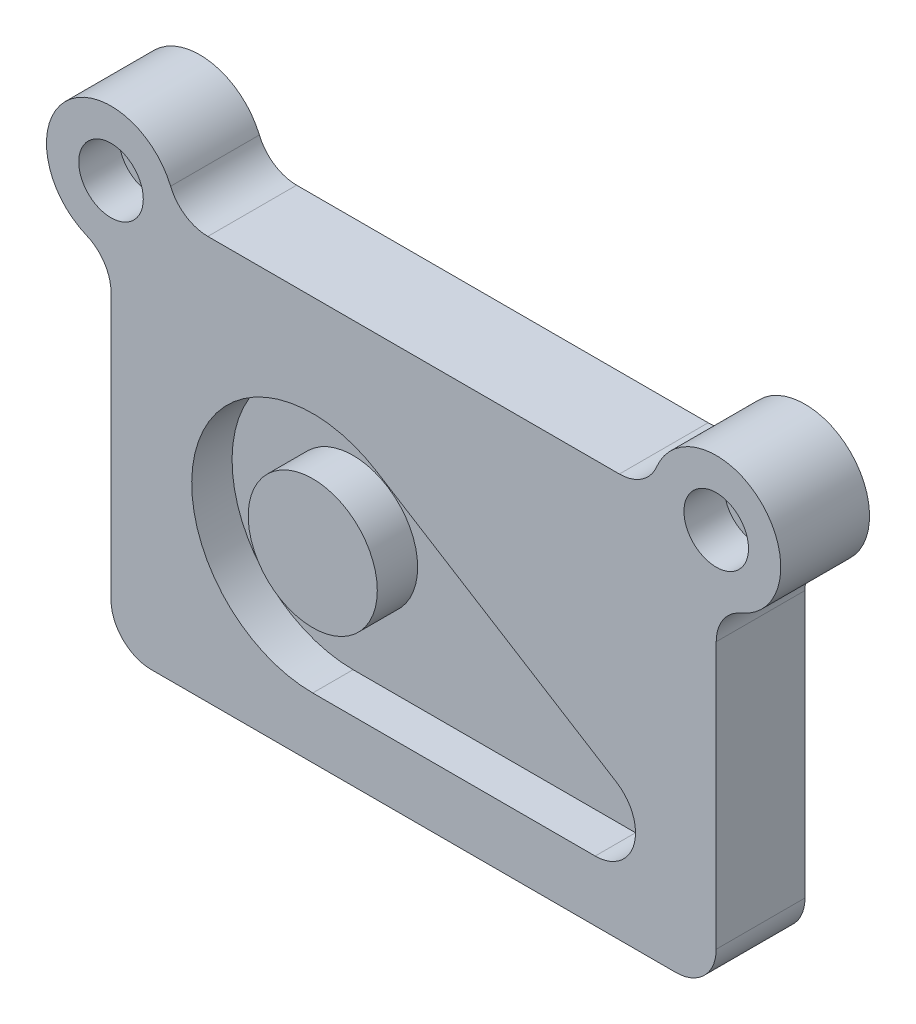
ISO-10303-21;
HEADER;
FILE_DESCRIPTION(('STEP AP214'),'2;1');
FILE_NAME('part.step','',(''),(''),'','','');
FILE_SCHEMA(('AUTOMOTIVE_DESIGN { 1 0 10303 214 1 1 1 1 }'));
ENDSEC;
DATA;
#1=APPLICATION_CONTEXT('core data for automotive mechanical design processes');
#2=APPLICATION_PROTOCOL_DEFINITION('international standard','automotive_design',2000,#1);
#3=PRODUCT_CONTEXT('',#1,'mechanical');
#4=PRODUCT('Part','Part','',(#3));
#5=PRODUCT_RELATED_PRODUCT_CATEGORY('part','',(#4));
#6=PRODUCT_DEFINITION_FORMATION('','',#4);
#7=PRODUCT_DEFINITION_CONTEXT('part definition',#1,'design');
#8=PRODUCT_DEFINITION('design','',#6,#7);
#9=PRODUCT_DEFINITION_SHAPE('','',#8);
#10=(LENGTH_UNIT() NAMED_UNIT(*) SI_UNIT(.MILLI.,.METRE.));
#11=(NAMED_UNIT(*) PLANE_ANGLE_UNIT() SI_UNIT($,.RADIAN.));
#12=(NAMED_UNIT(*) SI_UNIT($,.STERADIAN.) SOLID_ANGLE_UNIT());
#13=UNCERTAINTY_MEASURE_WITH_UNIT(LENGTH_MEASURE(1.E-05),#10,'distance_accuracy_value','');
#14=(GEOMETRIC_REPRESENTATION_CONTEXT(3) GLOBAL_UNCERTAINTY_ASSIGNED_CONTEXT((#13)) GLOBAL_UNIT_ASSIGNED_CONTEXT((#10,
#11,#12)) REPRESENTATION_CONTEXT('',''));
#15=CARTESIAN_POINT('',(0.,0.,0.));
#16=DIRECTION('',(0.,0.,1.));
#17=DIRECTION('',(1.,0.,0.));
#18=AXIS2_PLACEMENT_3D('',#15,#16,#17);
#19=CARTESIAN_POINT('',(150.,100.,-22.));
#20=DIRECTION('',(0.,0.,1.));
#21=DIRECTION('',(1.,0.,0.));
#22=AXIS2_PLACEMENT_3D('',#19,#20,#21);
#23=CYLINDRICAL_SURFACE('',#22,2.99999999999999);
#24=CARTESIAN_POINT('',(150.,100.,-22.));
#25=DIRECTION('',(0.,0.,1.));
#26=DIRECTION('',(1.,0.,0.));
#27=AXIS2_PLACEMENT_3D('',#24,#25,#26);
#28=CIRCLE('',#27,2.99999999999999);
#29=CARTESIAN_POINT('',(153.,100.,-22.));
#30=VERTEX_POINT('',#29);
#31=EDGE_CURVE('E366',#30,#30,#28,.T.);
#32=ORIENTED_EDGE('',*,*,#31,.F.);
#33=EDGE_LOOP('',(#32));
#34=FACE_BOUND('',#33,.T.);
#35=CARTESIAN_POINT('',(150.,100.,-10.));
#36=DIRECTION('',(0.,0.,1.));
#37=DIRECTION('',(1.,0.,0.));
#38=AXIS2_PLACEMENT_3D('',#35,#36,#37);
#39=CIRCLE('',#38,2.99999999999999);
#40=CARTESIAN_POINT('',(153.,100.,-10.));
#41=VERTEX_POINT('',#40);
#42=EDGE_CURVE('E129',#41,#41,#39,.F.);
#43=ORIENTED_EDGE('',*,*,#42,.F.);
#44=EDGE_LOOP('',(#43));
#45=FACE_BOUND('',#44,.T.);
#46=ADVANCED_FACE('F125',(#34,#45),#23,.F.);
#47=CARTESIAN_POINT('',(0.,100.,-22.));
#48=DIRECTION('',(0.,0.,1.));
#49=DIRECTION('',(1.,0.,0.));
#50=AXIS2_PLACEMENT_3D('',#47,#48,#49);
#51=CYLINDRICAL_SURFACE('',#50,3.);
#52=CARTESIAN_POINT('',(0.,100.,-22.));
#53=DIRECTION('',(0.,0.,1.));
#54=DIRECTION('',(1.,0.,0.));
#55=AXIS2_PLACEMENT_3D('',#52,#53,#54);
#56=CIRCLE('',#55,3.);
#57=CARTESIAN_POINT('',(3.,100.,-22.));
#58=VERTEX_POINT('',#57);
#59=EDGE_CURVE('E266',#58,#58,#56,.T.);
#60=ORIENTED_EDGE('',*,*,#59,.F.);
#61=EDGE_LOOP('',(#60));
#62=FACE_BOUND('',#61,.T.);
#63=CARTESIAN_POINT('',(0.,100.,-10.));
#64=DIRECTION('',(0.,0.,1.));
#65=DIRECTION('',(1.,0.,0.));
#66=AXIS2_PLACEMENT_3D('',#63,#64,#65);
#67=CIRCLE('',#66,3.);
#68=CARTESIAN_POINT('',(3.,100.,-10.));
#69=VERTEX_POINT('',#68);
#70=EDGE_CURVE('E312',#69,#69,#67,.F.);
#71=ORIENTED_EDGE('',*,*,#70,.F.);
#72=EDGE_LOOP('',(#71));
#73=FACE_BOUND('',#72,.T.);
#74=ADVANCED_FACE('F423',(#62,#73),#51,.F.);
#75=CARTESIAN_POINT('',(140.,10.,0.));
#76=DIRECTION('',(0.,0.,1.));
#77=DIRECTION('',(1.,0.,0.));
#78=AXIS2_PLACEMENT_3D('',#75,#76,#77);
#79=PLANE('',#78);
#80=CARTESIAN_POINT('',(150.,100.,0.));
#81=DIRECTION('',(0.,0.,1.));
#82=DIRECTION('',(1.,0.,0.));
#83=AXIS2_PLACEMENT_3D('',#80,#81,#82);
#84=CIRCLE('',#83,8.00000000000001);
#85=CARTESIAN_POINT('',(158.,100.,0.));
#86=VERTEX_POINT('',#85);
#87=EDGE_CURVE('E664',#86,#86,#84,.T.);
#88=ORIENTED_EDGE('',*,*,#87,.F.);
#89=EDGE_LOOP('',(#88));
#90=FACE_BOUND('',#89,.T.);
#91=CARTESIAN_POINT('',(0.,100.,0.));
#92=DIRECTION('',(0.,0.,1.));
#93=DIRECTION('',(1.,0.,0.));
#94=AXIS2_PLACEMENT_3D('',#91,#92,#93);
#95=CIRCLE('',#94,8.);
#96=CARTESIAN_POINT('',(8.,100.,0.));
#97=VERTEX_POINT('',#96);
#98=EDGE_CURVE('E322',#97,#97,#95,.T.);
#99=ORIENTED_EDGE('',*,*,#98,.F.);
#100=EDGE_LOOP('',(#99));
#101=FACE_BOUND('',#100,.T.);
#102=CARTESIAN_POINT('',(140.,10.,0.));
#103=DIRECTION('',(0.,0.,1.));
#104=DIRECTION('',(1.,0.,0.));
#105=AXIS2_PLACEMENT_3D('',#102,#103,#104);
#106=CIRCLE('',#105,10.);
#107=CARTESIAN_POINT('',(140.,0.,0.));
#108=VERTEX_POINT('',#107);
#109=CARTESIAN_POINT('',(150.,10.0000000000001,0.));
#110=VERTEX_POINT('',#109);
#111=EDGE_CURVE('E262',#108,#110,#106,.T.);
#112=ORIENTED_EDGE('',*,*,#111,.T.);
#113=DIRECTION('',(0.,-1.,0.));
#114=VECTOR('',#113,1.);
#115=CARTESIAN_POINT('',(150.,76.,0.));
#116=LINE('',#115,#114);
#117=CARTESIAN_POINT('',(150.,76.,0.));
#118=VERTEX_POINT('',#117);
#119=EDGE_CURVE('E265',#118,#110,#116,.T.);
#120=ORIENTED_EDGE('',*,*,#119,.F.);
#121=CARTESIAN_POINT('',(160.,76.,0.));
#122=DIRECTION('',(0.,0.,-1.));
#123=DIRECTION('',(-1.,0.,0.));
#124=AXIS2_PLACEMENT_3D('',#121,#122,#123);
#125=CIRCLE('',#124,10.);
#126=CARTESIAN_POINT('',(156.153846153846,85.2307692307693,0.));
#127=VERTEX_POINT('',#126);
#128=EDGE_CURVE('E269',#118,#127,#125,.T.);
#129=ORIENTED_EDGE('',*,*,#128,.T.);
#130=CARTESIAN_POINT('',(150.,100.,0.));
#131=DIRECTION('',(0.,0.,1.));
#132=DIRECTION('',(1.,0.,0.));
#133=AXIS2_PLACEMENT_3D('',#130,#131,#132);
#134=CIRCLE('',#133,16.);
#135=CARTESIAN_POINT('',(135.230769230769,106.153846153846,0.));
#136=VERTEX_POINT('',#135);
#137=EDGE_CURVE('E272',#127,#136,#134,.T.);
#138=ORIENTED_EDGE('',*,*,#137,.T.);
#139=CARTESIAN_POINT('',(126.,110.,0.));
#140=DIRECTION('',(0.,0.,-1.));
#141=DIRECTION('',(-1.,0.,0.));
#142=AXIS2_PLACEMENT_3D('',#139,#140,#141);
#143=CIRCLE('',#142,10.);
#144=CARTESIAN_POINT('',(126.,100.,0.));
#145=VERTEX_POINT('',#144);
#146=EDGE_CURVE('E275',#136,#145,#143,.T.);
#147=ORIENTED_EDGE('',*,*,#146,.T.);
#148=DIRECTION('',(-1.,0.,0.));
#149=VECTOR('',#148,1.);
#150=CARTESIAN_POINT('',(126.,100.,0.));
#151=LINE('',#150,#149);
#152=CARTESIAN_POINT('',(24.,100.,0.));
#153=VERTEX_POINT('',#152);
#154=EDGE_CURVE('E278',#145,#153,#151,.T.);
#155=ORIENTED_EDGE('',*,*,#154,.T.);
#156=CARTESIAN_POINT('',(24.,110.,0.));
#157=DIRECTION('',(0.,0.,-1.));
#158=DIRECTION('',(-1.,0.,0.));
#159=AXIS2_PLACEMENT_3D('',#156,#157,#158);
#160=CIRCLE('',#159,10.);
#161=CARTESIAN_POINT('',(14.7692307692308,106.153846153846,0.));
#162=VERTEX_POINT('',#161);
#163=EDGE_CURVE('E281',#153,#162,#160,.T.);
#164=ORIENTED_EDGE('',*,*,#163,.T.);
#165=CARTESIAN_POINT('',(0.,100.,0.));
#166=DIRECTION('',(0.,0.,1.));
#167=DIRECTION('',(1.,0.,0.));
#168=AXIS2_PLACEMENT_3D('',#165,#166,#167);
#169=CIRCLE('',#168,16.);
#170=CARTESIAN_POINT('',(-6.15384615384616,85.2307692307692,0.));
#171=VERTEX_POINT('',#170);
#172=EDGE_CURVE('E284',#162,#171,#169,.T.);
#173=ORIENTED_EDGE('',*,*,#172,.T.);
#174=CARTESIAN_POINT('',(-10.,76.,0.));
#175=DIRECTION('',(0.,0.,-1.));
#176=DIRECTION('',(-1.,0.,0.));
#177=AXIS2_PLACEMENT_3D('',#174,#175,#176);
#178=CIRCLE('',#177,10.);
#179=CARTESIAN_POINT('',(0.,76.,0.));
#180=VERTEX_POINT('',#179);
#181=EDGE_CURVE('E287',#171,#180,#178,.T.);
#182=ORIENTED_EDGE('',*,*,#181,.T.);
#183=DIRECTION('',(0.,-1.,0.));
#184=VECTOR('',#183,1.);
#185=CARTESIAN_POINT('',(0.,76.,0.));
#186=LINE('',#185,#184);
#187=CARTESIAN_POINT('',(0.,10.0000000000001,0.));
#188=VERTEX_POINT('',#187);
#189=EDGE_CURVE('E290',#180,#188,#186,.T.);
#190=ORIENTED_EDGE('',*,*,#189,.T.);
#191=CARTESIAN_POINT('',(10.,10.,0.));
#192=DIRECTION('',(0.,0.,1.));
#193=DIRECTION('',(1.,0.,0.));
#194=AXIS2_PLACEMENT_3D('',#191,#192,#193);
#195=CIRCLE('',#194,10.);
#196=CARTESIAN_POINT('',(10.0000000000001,0.,0.));
#197=VERTEX_POINT('',#196);
#198=EDGE_CURVE('E238',#188,#197,#195,.T.);
#199=ORIENTED_EDGE('',*,*,#198,.T.);
#200=DIRECTION('',(-1.,0.,0.));
#201=VECTOR('',#200,1.);
#202=CARTESIAN_POINT('',(140.,0.,0.));
#203=LINE('',#202,#201);
#204=EDGE_CURVE('E293',#108,#197,#203,.T.);
#205=ORIENTED_EDGE('',*,*,#204,.F.);
#206=EDGE_LOOP('',(#112,#120,#129,#138,#147,#155,#164,#173,#182,#190,#199,#205));
#207=FACE_BOUND('',#206,.T.);
#208=CARTESIAN_POINT('',(120.,25.,0.));
#209=DIRECTION('',(0.,0.,1.));
#210=DIRECTION('',(1.,0.,0.));
#211=AXIS2_PLACEMENT_3D('',#208,#209,#210);
#212=CIRCLE('',#211,10.);
#213=CARTESIAN_POINT('',(120.,15.,0.));
#214=VERTEX_POINT('',#213);
#215=CARTESIAN_POINT('',(125.283018867925,33.4905660377358,0.));
#216=VERTEX_POINT('',#215);
#217=EDGE_CURVE('E338',#214,#216,#212,.T.);
#218=ORIENTED_EDGE('',*,*,#217,.F.);
#219=DIRECTION('',(-1.,0.,0.));
#220=VECTOR('',#219,1.);
#221=CARTESIAN_POINT('',(140.,15.,0.));
#222=LINE('',#221,#220);
#223=CARTESIAN_POINT('',(50.,15.,0.));
#224=VERTEX_POINT('',#223);
#225=EDGE_CURVE('E142',#214,#224,#222,.T.);
#226=ORIENTED_EDGE('',*,*,#225,.T.);
#227=CARTESIAN_POINT('',(50.,45.,0.));
#228=DIRECTION('',(0.,0.,1.));
#229=DIRECTION('',(1.,0.,0.));
#230=AXIS2_PLACEMENT_3D('',#227,#228,#229);
#231=CIRCLE('',#230,30.);
#232=CARTESIAN_POINT('',(65.8490566037736,70.4716981132076,0.));
#233=VERTEX_POINT('',#232);
#234=EDGE_CURVE('E349',#233,#224,#231,.T.);
#235=ORIENTED_EDGE('',*,*,#234,.F.);
#236=DIRECTION('',(-0.849056603773585,0.528301886792453,0.));
#237=VECTOR('',#236,1.);
#238=CARTESIAN_POINT('',(146.429334282663,20.3328586685653,0.));
#239=LINE('',#238,#237);
#240=EDGE_CURVE('E352',#216,#233,#239,.T.);
#241=ORIENTED_EDGE('',*,*,#240,.F.);
#242=EDGE_LOOP('',(#218,#226,#235,#241));
#243=FACE_BOUND('',#242,.T.);
#244=ADVANCED_FACE('F417',(#90,#101,#207,#243),#79,.T.);
#245=CARTESIAN_POINT('',(140.,10.,-22.));
#246=DIRECTION('',(0.,0.,1.));
#247=DIRECTION('',(1.,0.,0.));
#248=AXIS2_PLACEMENT_3D('',#245,#246,#247);
#249=CYLINDRICAL_SURFACE('',#248,10.);
#250=ORIENTED_EDGE('',*,*,#111,.F.);
#251=DIRECTION('',(0.,0.,1.));
#252=VECTOR('',#251,1.);
#253=CARTESIAN_POINT('',(140.,0.,-22.));
#254=LINE('',#253,#252);
#255=CARTESIAN_POINT('',(140.,0.,-22.));
#256=VERTEX_POINT('',#255);
#257=EDGE_CURVE('E12',#256,#108,#254,.T.);
#258=ORIENTED_EDGE('',*,*,#257,.F.);
#259=CARTESIAN_POINT('',(140.,10.,-22.));
#260=DIRECTION('',(0.,0.,1.));
#261=DIRECTION('',(1.,0.,0.));
#262=AXIS2_PLACEMENT_3D('',#259,#260,#261);
#263=CIRCLE('',#262,10.);
#264=CARTESIAN_POINT('',(150.,10.0000000000001,-22.));
#265=VERTEX_POINT('',#264);
#266=EDGE_CURVE('E294',#256,#265,#263,.T.);
#267=ORIENTED_EDGE('',*,*,#266,.T.);
#268=DIRECTION('',(0.,0.,1.));
#269=VECTOR('',#268,1.);
#270=CARTESIAN_POINT('',(150.,10.0000000000001,-22.));
#271=LINE('',#270,#269);
#272=EDGE_CURVE('E261',#265,#110,#271,.T.);
#273=ORIENTED_EDGE('',*,*,#272,.T.);
#274=EDGE_LOOP('',(#250,#258,#267,#273));
#275=FACE_BOUND('',#274,.T.);
#276=ADVANCED_FACE('F127',(#275),#249,.T.);
#277=CARTESIAN_POINT('',(140.,0.,-22.));
#278=DIRECTION('',(0.,1.,0.));
#279=DIRECTION('',(0.,0.,1.));
#280=AXIS2_PLACEMENT_3D('',#277,#278,#279);
#281=PLANE('',#280);
#282=ORIENTED_EDGE('',*,*,#204,.T.);
#283=DIRECTION('',(0.,0.,1.));
#284=VECTOR('',#283,1.);
#285=CARTESIAN_POINT('',(10.0000000000001,0.,-22.));
#286=LINE('',#285,#284);
#287=CARTESIAN_POINT('',(10.0000000000001,0.,-22.));
#288=VERTEX_POINT('',#287);
#289=EDGE_CURVE('E134',#288,#197,#286,.T.);
#290=ORIENTED_EDGE('',*,*,#289,.F.);
#291=DIRECTION('',(-1.,0.,0.));
#292=VECTOR('',#291,1.);
#293=CARTESIAN_POINT('',(140.,0.,-22.));
#294=LINE('',#293,#292);
#295=EDGE_CURVE('E250',#256,#288,#294,.T.);
#296=ORIENTED_EDGE('',*,*,#295,.F.);
#297=ORIENTED_EDGE('',*,*,#257,.T.);
#298=EDGE_LOOP('',(#282,#290,#296,#297));
#299=FACE_BOUND('',#298,.T.);
#300=ADVANCED_FACE('F416',(#299),#281,.F.);
#301=CARTESIAN_POINT('',(10.,10.,-22.));
#302=DIRECTION('',(0.,0.,1.));
#303=DIRECTION('',(1.,0.,0.));
#304=AXIS2_PLACEMENT_3D('',#301,#302,#303);
#305=CYLINDRICAL_SURFACE('',#304,10.);
#306=ORIENTED_EDGE('',*,*,#198,.F.);
#307=DIRECTION('',(0.,0.,1.));
#308=VECTOR('',#307,1.);
#309=CARTESIAN_POINT('',(0.,10.0000000000001,-22.));
#310=LINE('',#309,#308);
#311=CARTESIAN_POINT('',(0.,10.0000000000001,-22.));
#312=VERTEX_POINT('',#311);
#313=EDGE_CURVE('E233',#312,#188,#310,.T.);
#314=ORIENTED_EDGE('',*,*,#313,.F.);
#315=CARTESIAN_POINT('',(10.,10.,-22.));
#316=DIRECTION('',(0.,0.,1.));
#317=DIRECTION('',(1.,0.,0.));
#318=AXIS2_PLACEMENT_3D('',#315,#316,#317);
#319=CIRCLE('',#318,10.);
#320=EDGE_CURVE('E236',#312,#288,#319,.T.);
#321=ORIENTED_EDGE('',*,*,#320,.T.);
#322=ORIENTED_EDGE('',*,*,#289,.T.);
#323=EDGE_LOOP('',(#306,#314,#321,#322));
#324=FACE_BOUND('',#323,.T.);
#325=ADVANCED_FACE('F235',(#324),#305,.T.);
#326=CARTESIAN_POINT('',(0.,76.,-22.));
#327=DIRECTION('',(-1.,0.,0.));
#328=DIRECTION('',(0.,0.,1.));
#329=AXIS2_PLACEMENT_3D('',#326,#327,#328);
#330=PLANE('',#329);
#331=ORIENTED_EDGE('',*,*,#189,.F.);
#332=DIRECTION('',(0.,0.,1.));
#333=VECTOR('',#332,1.);
#334=CARTESIAN_POINT('',(0.,76.,-22.));
#335=LINE('',#334,#333);
#336=CARTESIAN_POINT('',(0.,76.,-22.));
#337=VERTEX_POINT('',#336);
#338=EDGE_CURVE('E243',#337,#180,#335,.T.);
#339=ORIENTED_EDGE('',*,*,#338,.F.);
#340=DIRECTION('',(0.,-1.,0.));
#341=VECTOR('',#340,1.);
#342=CARTESIAN_POINT('',(0.,76.,-22.));
#343=LINE('',#342,#341);
#344=EDGE_CURVE('E248',#337,#312,#343,.T.);
#345=ORIENTED_EDGE('',*,*,#344,.T.);
#346=ORIENTED_EDGE('',*,*,#313,.T.);
#347=EDGE_LOOP('',(#331,#339,#345,#346));
#348=FACE_BOUND('',#347,.T.);
#349=ADVANCED_FACE('F253',(#348),#330,.T.);
#350=CARTESIAN_POINT('',(-10.,76.,-22.));
#351=DIRECTION('',(0.,0.,1.));
#352=DIRECTION('',(1.,0.,0.));
#353=AXIS2_PLACEMENT_3D('',#350,#351,#352);
#354=CYLINDRICAL_SURFACE('',#353,10.);
#355=ORIENTED_EDGE('',*,*,#181,.F.);
#356=DIRECTION('',(0.,0.,1.));
#357=VECTOR('',#356,1.);
#358=CARTESIAN_POINT('',(-6.15384615384616,85.2307692307692,-22.));
#359=LINE('',#358,#357);
#360=CARTESIAN_POINT('',(-6.15384615384616,85.2307692307692,-22.));
#361=VERTEX_POINT('',#360);
#362=EDGE_CURVE('E298',#361,#171,#359,.T.);
#363=ORIENTED_EDGE('',*,*,#362,.F.);
#364=CARTESIAN_POINT('',(-10.,76.,-22.));
#365=DIRECTION('',(0.,0.,-1.));
#366=DIRECTION('',(-1.,0.,0.));
#367=AXIS2_PLACEMENT_3D('',#364,#365,#366);
#368=CIRCLE('',#367,10.);
#369=EDGE_CURVE('E254',#361,#337,#368,.T.);
#370=ORIENTED_EDGE('',*,*,#369,.T.);
#371=ORIENTED_EDGE('',*,*,#338,.T.);
#372=EDGE_LOOP('',(#355,#363,#370,#371));
#373=FACE_BOUND('',#372,.T.);
#374=ADVANCED_FACE('F448',(#373),#354,.F.);
#375=CARTESIAN_POINT('',(0.,100.,-22.));
#376=DIRECTION('',(0.,0.,1.));
#377=DIRECTION('',(1.,0.,0.));
#378=AXIS2_PLACEMENT_3D('',#375,#376,#377);
#379=CYLINDRICAL_SURFACE('',#378,16.);
#380=ORIENTED_EDGE('',*,*,#172,.F.);
#381=DIRECTION('',(0.,0.,1.));
#382=VECTOR('',#381,1.);
#383=CARTESIAN_POINT('',(14.7692307692308,106.153846153846,-22.));
#384=LINE('',#383,#382);
#385=CARTESIAN_POINT('',(14.7692307692308,106.153846153846,-22.));
#386=VERTEX_POINT('',#385);
#387=EDGE_CURVE('E300',#386,#162,#384,.T.);
#388=ORIENTED_EDGE('',*,*,#387,.F.);
#389=CARTESIAN_POINT('',(0.,100.,-22.));
#390=DIRECTION('',(0.,0.,1.));
#391=DIRECTION('',(1.,0.,0.));
#392=AXIS2_PLACEMENT_3D('',#389,#390,#391);
#393=CIRCLE('',#392,16.);
#394=EDGE_CURVE('E256',#386,#361,#393,.T.);
#395=ORIENTED_EDGE('',*,*,#394,.T.);
#396=ORIENTED_EDGE('',*,*,#362,.T.);
#397=EDGE_LOOP('',(#380,#388,#395,#396));
#398=FACE_BOUND('',#397,.T.);
#399=ADVANCED_FACE('F391',(#398),#379,.T.);
#400=CARTESIAN_POINT('',(24.,110.,-22.));
#401=DIRECTION('',(0.,0.,1.));
#402=DIRECTION('',(1.,0.,0.));
#403=AXIS2_PLACEMENT_3D('',#400,#401,#402);
#404=CYLINDRICAL_SURFACE('',#403,10.);
#405=ORIENTED_EDGE('',*,*,#163,.F.);
#406=DIRECTION('',(0.,0.,1.));
#407=VECTOR('',#406,1.);
#408=CARTESIAN_POINT('',(24.,100.,-22.));
#409=LINE('',#408,#407);
#410=CARTESIAN_POINT('',(24.,100.,-22.));
#411=VERTEX_POINT('',#410);
#412=EDGE_CURVE('E302',#411,#153,#409,.T.);
#413=ORIENTED_EDGE('',*,*,#412,.F.);
#414=CARTESIAN_POINT('',(24.,110.,-22.));
#415=DIRECTION('',(0.,0.,-1.));
#416=DIRECTION('',(-1.,0.,0.));
#417=AXIS2_PLACEMENT_3D('',#414,#415,#416);
#418=CIRCLE('',#417,10.);
#419=EDGE_CURVE('E385',#411,#386,#418,.T.);
#420=ORIENTED_EDGE('',*,*,#419,.T.);
#421=ORIENTED_EDGE('',*,*,#387,.T.);
#422=EDGE_LOOP('',(#405,#413,#420,#421));
#423=FACE_BOUND('',#422,.T.);
#424=ADVANCED_FACE('F397',(#423),#404,.F.);
#425=CARTESIAN_POINT('',(126.,100.,-22.));
#426=DIRECTION('',(0.,1.,0.));
#427=DIRECTION('',(0.,0.,1.));
#428=AXIS2_PLACEMENT_3D('',#425,#426,#427);
#429=PLANE('',#428);
#430=ORIENTED_EDGE('',*,*,#154,.F.);
#431=DIRECTION('',(0.,0.,1.));
#432=VECTOR('',#431,1.);
#433=CARTESIAN_POINT('',(126.,100.,-22.));
#434=LINE('',#433,#432);
#435=CARTESIAN_POINT('',(126.,100.,-22.));
#436=VERTEX_POINT('',#435);
#437=EDGE_CURVE('E304',#436,#145,#434,.T.);
#438=ORIENTED_EDGE('',*,*,#437,.F.);
#439=DIRECTION('',(-1.,0.,0.));
#440=VECTOR('',#439,1.);
#441=CARTESIAN_POINT('',(126.,100.,-22.));
#442=LINE('',#441,#440);
#443=EDGE_CURVE('E382',#436,#411,#442,.T.);
#444=ORIENTED_EDGE('',*,*,#443,.T.);
#445=ORIENTED_EDGE('',*,*,#412,.T.);
#446=EDGE_LOOP('',(#430,#438,#444,#445));
#447=FACE_BOUND('',#446,.T.);
#448=ADVANCED_FACE('F400',(#447),#429,.T.);
#449=CARTESIAN_POINT('',(126.,110.,-22.));
#450=DIRECTION('',(0.,0.,1.));
#451=DIRECTION('',(1.,0.,0.));
#452=AXIS2_PLACEMENT_3D('',#449,#450,#451);
#453=CYLINDRICAL_SURFACE('',#452,10.);
#454=ORIENTED_EDGE('',*,*,#146,.F.);
#455=DIRECTION('',(0.,0.,1.));
#456=VECTOR('',#455,1.);
#457=CARTESIAN_POINT('',(135.230769230769,106.153846153846,-22.));
#458=LINE('',#457,#456);
#459=CARTESIAN_POINT('',(135.230769230769,106.153846153846,-22.));
#460=VERTEX_POINT('',#459);
#461=EDGE_CURVE('E306',#460,#136,#458,.T.);
#462=ORIENTED_EDGE('',*,*,#461,.F.);
#463=CARTESIAN_POINT('',(126.,110.,-22.));
#464=DIRECTION('',(0.,0.,-1.));
#465=DIRECTION('',(-1.,0.,0.));
#466=AXIS2_PLACEMENT_3D('',#463,#464,#465);
#467=CIRCLE('',#466,10.);
#468=EDGE_CURVE('E379',#460,#436,#467,.T.);
#469=ORIENTED_EDGE('',*,*,#468,.T.);
#470=ORIENTED_EDGE('',*,*,#437,.T.);
#471=EDGE_LOOP('',(#454,#462,#469,#470));
#472=FACE_BOUND('',#471,.T.);
#473=ADVANCED_FACE('F405',(#472),#453,.F.);
#474=CARTESIAN_POINT('',(150.,100.,-22.));
#475=DIRECTION('',(0.,0.,1.));
#476=DIRECTION('',(1.,0.,0.));
#477=AXIS2_PLACEMENT_3D('',#474,#475,#476);
#478=CYLINDRICAL_SURFACE('',#477,16.);
#479=ORIENTED_EDGE('',*,*,#137,.F.);
#480=DIRECTION('',(0.,0.,1.));
#481=VECTOR('',#480,1.);
#482=CARTESIAN_POINT('',(156.153846153846,85.2307692307693,-22.));
#483=LINE('',#482,#481);
#484=CARTESIAN_POINT('',(156.153846153846,85.2307692307693,-22.));
#485=VERTEX_POINT('',#484);
#486=EDGE_CURVE('E308',#485,#127,#483,.T.);
#487=ORIENTED_EDGE('',*,*,#486,.F.);
#488=CARTESIAN_POINT('',(150.,100.,-22.));
#489=DIRECTION('',(0.,0.,1.));
#490=DIRECTION('',(1.,0.,0.));
#491=AXIS2_PLACEMENT_3D('',#488,#489,#490);
#492=CIRCLE('',#491,16.);
#493=EDGE_CURVE('E376',#485,#460,#492,.T.);
#494=ORIENTED_EDGE('',*,*,#493,.T.);
#495=ORIENTED_EDGE('',*,*,#461,.T.);
#496=EDGE_LOOP('',(#479,#487,#494,#495));
#497=FACE_BOUND('',#496,.T.);
#498=ADVANCED_FACE('F408',(#497),#478,.T.);
#499=CARTESIAN_POINT('',(160.,76.,-22.));
#500=DIRECTION('',(0.,0.,1.));
#501=DIRECTION('',(1.,0.,0.));
#502=AXIS2_PLACEMENT_3D('',#499,#500,#501);
#503=CYLINDRICAL_SURFACE('',#502,10.);
#504=ORIENTED_EDGE('',*,*,#128,.F.);
#505=DIRECTION('',(0.,0.,1.));
#506=VECTOR('',#505,1.);
#507=CARTESIAN_POINT('',(150.,76.,-22.));
#508=LINE('',#507,#506);
#509=CARTESIAN_POINT('',(150.,76.,-22.));
#510=VERTEX_POINT('',#509);
#511=EDGE_CURVE('E310',#510,#118,#508,.T.);
#512=ORIENTED_EDGE('',*,*,#511,.F.);
#513=CARTESIAN_POINT('',(160.,76.,-22.));
#514=DIRECTION('',(0.,0.,-1.));
#515=DIRECTION('',(-1.,0.,0.));
#516=AXIS2_PLACEMENT_3D('',#513,#514,#515);
#517=CIRCLE('',#516,10.);
#518=EDGE_CURVE('E373',#510,#485,#517,.T.);
#519=ORIENTED_EDGE('',*,*,#518,.T.);
#520=ORIENTED_EDGE('',*,*,#486,.T.);
#521=EDGE_LOOP('',(#504,#512,#519,#520));
#522=FACE_BOUND('',#521,.T.);
#523=ADVANCED_FACE('F411',(#522),#503,.F.);
#524=CARTESIAN_POINT('',(150.,76.,-22.));
#525=DIRECTION('',(-1.,0.,0.));
#526=DIRECTION('',(0.,0.,1.));
#527=AXIS2_PLACEMENT_3D('',#524,#525,#526);
#528=PLANE('',#527);
#529=ORIENTED_EDGE('',*,*,#119,.T.);
#530=ORIENTED_EDGE('',*,*,#272,.F.);
#531=DIRECTION('',(0.,-1.,0.));
#532=VECTOR('',#531,1.);
#533=CARTESIAN_POINT('',(150.,76.,-22.));
#534=LINE('',#533,#532);
#535=EDGE_CURVE('E201',#510,#265,#534,.T.);
#536=ORIENTED_EDGE('',*,*,#535,.F.);
#537=ORIENTED_EDGE('',*,*,#511,.T.);
#538=EDGE_LOOP('',(#529,#530,#536,#537));
#539=FACE_BOUND('',#538,.T.);
#540=ADVANCED_FACE('F414',(#539),#528,.F.);
#541=CARTESIAN_POINT('',(140.,10.,-22.));
#542=DIRECTION('',(0.,0.,1.));
#543=DIRECTION('',(1.,0.,0.));
#544=AXIS2_PLACEMENT_3D('',#541,#542,#543);
#545=PLANE('',#544);
#546=ORIENTED_EDGE('',*,*,#31,.T.);
#547=EDGE_LOOP('',(#546));
#548=FACE_BOUND('',#547,.T.);
#549=ORIENTED_EDGE('',*,*,#59,.T.);
#550=EDGE_LOOP('',(#549));
#551=FACE_BOUND('',#550,.T.);
#552=ORIENTED_EDGE('',*,*,#266,.F.);
#553=ORIENTED_EDGE('',*,*,#295,.T.);
#554=ORIENTED_EDGE('',*,*,#320,.F.);
#555=ORIENTED_EDGE('',*,*,#344,.F.);
#556=ORIENTED_EDGE('',*,*,#369,.F.);
#557=ORIENTED_EDGE('',*,*,#394,.F.);
#558=ORIENTED_EDGE('',*,*,#419,.F.);
#559=ORIENTED_EDGE('',*,*,#443,.F.);
#560=ORIENTED_EDGE('',*,*,#468,.F.);
#561=ORIENTED_EDGE('',*,*,#493,.F.);
#562=ORIENTED_EDGE('',*,*,#518,.F.);
#563=ORIENTED_EDGE('',*,*,#535,.T.);
#564=EDGE_LOOP('',(#552,#553,#554,#555,#556,#557,#558,#559,#560,#561,#562,#563));
#565=FACE_BOUND('',#564,.T.);
#566=ADVANCED_FACE('F246',(#548,#551,#565),#545,.F.);
#567=CARTESIAN_POINT('',(140.,15.,-10.));
#568=DIRECTION('',(0.,1.,0.));
#569=DIRECTION('',(-1.,0.,0.));
#570=AXIS2_PLACEMENT_3D('',#567,#568,#569);
#571=PLANE('',#570);
#572=ORIENTED_EDGE('',*,*,#225,.F.);
#573=DIRECTION('',(0.,0.,1.));
#574=VECTOR('',#573,1.);
#575=CARTESIAN_POINT('',(120.,15.,-10.));
#576=LINE('',#575,#574);
#577=CARTESIAN_POINT('',(120.,15.,-10.));
#578=VERTEX_POINT('',#577);
#579=EDGE_CURVE('E347',#578,#214,#576,.T.);
#580=ORIENTED_EDGE('',*,*,#579,.F.);
#581=DIRECTION('',(-1.,0.,0.));
#582=VECTOR('',#581,1.);
#583=CARTESIAN_POINT('',(140.,15.,-10.));
#584=LINE('',#583,#582);
#585=CARTESIAN_POINT('',(50.,15.,-10.));
#586=VERTEX_POINT('',#585);
#587=EDGE_CURVE('E334',#578,#586,#584,.T.);
#588=ORIENTED_EDGE('',*,*,#587,.T.);
#589=DIRECTION('',(0.,0.,1.));
#590=VECTOR('',#589,1.);
#591=CARTESIAN_POINT('',(50.,15.,-10.));
#592=LINE('',#591,#590);
#593=EDGE_CURVE('E364',#586,#224,#592,.T.);
#594=ORIENTED_EDGE('',*,*,#593,.T.);
#595=EDGE_LOOP('',(#572,#580,#588,#594));
#596=FACE_BOUND('',#595,.T.);
#597=ADVANCED_FACE('F438',(#596),#571,.T.);
#598=CARTESIAN_POINT('',(50.,45.,-10.));
#599=DIRECTION('',(0.,0.,1.));
#600=DIRECTION('',(1.,0.,0.));
#601=AXIS2_PLACEMENT_3D('',#598,#599,#600);
#602=CYLINDRICAL_SURFACE('',#601,30.);
#603=ORIENTED_EDGE('',*,*,#234,.T.);
#604=ORIENTED_EDGE('',*,*,#593,.F.);
#605=CARTESIAN_POINT('',(50.,45.,-10.));
#606=DIRECTION('',(0.,0.,1.));
#607=DIRECTION('',(1.,0.,0.));
#608=AXIS2_PLACEMENT_3D('',#605,#606,#607);
#609=CIRCLE('',#608,30.);
#610=CARTESIAN_POINT('',(65.8490566037736,70.4716981132076,-10.));
#611=VERTEX_POINT('',#610);
#612=EDGE_CURVE('E337',#611,#586,#609,.T.);
#613=ORIENTED_EDGE('',*,*,#612,.F.);
#614=DIRECTION('',(0.,0.,1.));
#615=VECTOR('',#614,1.);
#616=CARTESIAN_POINT('',(65.8490566037736,70.4716981132076,-10.));
#617=LINE('',#616,#615);
#618=EDGE_CURVE('E361',#611,#233,#617,.T.);
#619=ORIENTED_EDGE('',*,*,#618,.T.);
#620=EDGE_LOOP('',(#603,#604,#613,#619));
#621=FACE_BOUND('',#620,.T.);
#622=ADVANCED_FACE('F478',(#621),#602,.F.);
#623=CARTESIAN_POINT('',(146.429334282663,20.3328586685653,-10.));
#624=DIRECTION('',(0.528301886792453,0.849056603773585,0.));
#625=DIRECTION('',(-0.849056603773585,0.528301886792453,0.));
#626=AXIS2_PLACEMENT_3D('',#623,#624,#625);
#627=PLANE('',#626);
#628=ORIENTED_EDGE('',*,*,#240,.T.);
#629=ORIENTED_EDGE('',*,*,#618,.F.);
#630=DIRECTION('',(-0.849056603773585,0.528301886792453,0.));
#631=VECTOR('',#630,1.);
#632=CARTESIAN_POINT('',(146.429334282663,20.3328586685653,-10.));
#633=LINE('',#632,#631);
#634=CARTESIAN_POINT('',(125.283018867925,33.4905660377358,-10.));
#635=VERTEX_POINT('',#634);
#636=EDGE_CURVE('E341',#635,#611,#633,.T.);
#637=ORIENTED_EDGE('',*,*,#636,.F.);
#638=DIRECTION('',(0.,0.,1.));
#639=VECTOR('',#638,1.);
#640=CARTESIAN_POINT('',(125.283018867925,33.4905660377358,-10.));
#641=LINE('',#640,#639);
#642=EDGE_CURVE('E358',#635,#216,#641,.T.);
#643=ORIENTED_EDGE('',*,*,#642,.T.);
#644=EDGE_LOOP('',(#628,#629,#637,#643));
#645=FACE_BOUND('',#644,.T.);
#646=ADVANCED_FACE('F484',(#645),#627,.F.);
#647=CARTESIAN_POINT('',(120.,25.,-10.));
#648=DIRECTION('',(0.,0.,1.));
#649=DIRECTION('',(1.,0.,0.));
#650=AXIS2_PLACEMENT_3D('',#647,#648,#649);
#651=CYLINDRICAL_SURFACE('',#650,10.);
#652=ORIENTED_EDGE('',*,*,#217,.T.);
#653=ORIENTED_EDGE('',*,*,#642,.F.);
#654=CARTESIAN_POINT('',(120.,25.,-10.));
#655=DIRECTION('',(0.,0.,1.));
#656=DIRECTION('',(1.,0.,0.));
#657=AXIS2_PLACEMENT_3D('',#654,#655,#656);
#658=CIRCLE('',#657,10.);
#659=EDGE_CURVE('E344',#578,#635,#658,.T.);
#660=ORIENTED_EDGE('',*,*,#659,.F.);
#661=ORIENTED_EDGE('',*,*,#579,.T.);
#662=EDGE_LOOP('',(#652,#653,#660,#661));
#663=FACE_BOUND('',#662,.T.);
#664=ADVANCED_FACE('F491',(#663),#651,.F.);
#665=CARTESIAN_POINT('',(50.,45.,-10.));
#666=DIRECTION('',(0.,0.,1.));
#667=DIRECTION('',(1.,0.,0.));
#668=AXIS2_PLACEMENT_3D('',#665,#666,#667);
#669=PLANE('',#668);
#670=CARTESIAN_POINT('',(50.,45.,-10.));
#671=DIRECTION('',(0.,0.,1.));
#672=DIRECTION('',(1.,0.,0.));
#673=AXIS2_PLACEMENT_3D('',#670,#671,#672);
#674=CIRCLE('',#673,16.);
#675=CARTESIAN_POINT('',(66.,45.,-10.));
#676=VERTEX_POINT('',#675);
#677=EDGE_CURVE('E319',#676,#676,#674,.T.);
#678=ORIENTED_EDGE('',*,*,#677,.F.);
#679=EDGE_LOOP('',(#678));
#680=FACE_BOUND('',#679,.T.);
#681=ORIENTED_EDGE('',*,*,#587,.F.);
#682=ORIENTED_EDGE('',*,*,#659,.T.);
#683=ORIENTED_EDGE('',*,*,#636,.T.);
#684=ORIENTED_EDGE('',*,*,#612,.T.);
#685=EDGE_LOOP('',(#681,#682,#683,#684));
#686=FACE_BOUND('',#685,.T.);
#687=ADVANCED_FACE('F499',(#680,#686),#669,.T.);
#688=CARTESIAN_POINT('',(50.,45.,-10.));
#689=DIRECTION('',(0.,0.,1.));
#690=DIRECTION('',(1.,0.,0.));
#691=AXIS2_PLACEMENT_3D('',#688,#689,#690);
#692=CYLINDRICAL_SURFACE('',#691,16.);
#693=ORIENTED_EDGE('',*,*,#677,.T.);
#694=EDGE_LOOP('',(#693));
#695=FACE_BOUND('',#694,.T.);
#696=CARTESIAN_POINT('',(50.,45.,0.));
#697=DIRECTION('',(0.,0.,1.));
#698=DIRECTION('',(1.,0.,0.));
#699=AXIS2_PLACEMENT_3D('',#696,#697,#698);
#700=CIRCLE('',#699,16.);
#701=CARTESIAN_POINT('',(66.,45.,0.));
#702=VERTEX_POINT('',#701);
#703=EDGE_CURVE('E314',#702,#702,#700,.T.);
#704=ORIENTED_EDGE('',*,*,#703,.F.);
#705=EDGE_LOOP('',(#704));
#706=FACE_BOUND('',#705,.T.);
#707=ADVANCED_FACE('F507',(#695,#706),#692,.T.);
#708=ORIENTED_EDGE('',*,*,#703,.T.);
#709=EDGE_LOOP('',(#708));
#710=FACE_BOUND('',#709,.T.);
#711=ADVANCED_FACE('F426',(#710),#79,.T.);
#712=CARTESIAN_POINT('',(0.,100.,-10.));
#713=DIRECTION('',(0.,0.,1.));
#714=DIRECTION('',(1.,0.,0.));
#715=AXIS2_PLACEMENT_3D('',#712,#713,#714);
#716=PLANE('',#715);
#717=CARTESIAN_POINT('',(0.,100.,-10.));
#718=DIRECTION('',(0.,0.,1.));
#719=DIRECTION('',(1.,0.,0.));
#720=AXIS2_PLACEMENT_3D('',#717,#718,#719);
#721=CIRCLE('',#720,8.);
#722=CARTESIAN_POINT('',(8.,100.,-10.));
#723=VERTEX_POINT('',#722);
#724=EDGE_CURVE('E315',#723,#723,#721,.T.);
#725=ORIENTED_EDGE('',*,*,#724,.T.);
#726=EDGE_LOOP('',(#725));
#727=FACE_BOUND('',#726,.T.);
#728=ORIENTED_EDGE('',*,*,#70,.T.);
#729=EDGE_LOOP('',(#728));
#730=FACE_BOUND('',#729,.T.);
#731=ADVANCED_FACE('F522',(#727,#730),#716,.T.);
#732=CARTESIAN_POINT('',(0.,100.,-10.));
#733=DIRECTION('',(0.,0.,1.));
#734=DIRECTION('',(1.,0.,0.));
#735=AXIS2_PLACEMENT_3D('',#732,#733,#734);
#736=CYLINDRICAL_SURFACE('',#735,8.);
#737=ORIENTED_EDGE('',*,*,#724,.F.);
#738=EDGE_LOOP('',(#737));
#739=FACE_BOUND('',#738,.T.);
#740=ORIENTED_EDGE('',*,*,#98,.T.);
#741=EDGE_LOOP('',(#740));
#742=FACE_BOUND('',#741,.T.);
#743=ADVANCED_FACE('F529',(#739,#742),#736,.F.);
#744=CARTESIAN_POINT('',(150.,100.,-10.));
#745=DIRECTION('',(0.,0.,1.));
#746=DIRECTION('',(1.,0.,0.));
#747=AXIS2_PLACEMENT_3D('',#744,#745,#746);
#748=PLANE('',#747);
#749=CARTESIAN_POINT('',(150.,100.,-10.));
#750=DIRECTION('',(0.,0.,1.));
#751=DIRECTION('',(1.,0.,0.));
#752=AXIS2_PLACEMENT_3D('',#749,#750,#751);
#753=CIRCLE('',#752,8.00000000000001);
#754=CARTESIAN_POINT('',(158.,100.,-10.));
#755=VERTEX_POINT('',#754);
#756=EDGE_CURVE('E329',#755,#755,#753,.T.);
#757=ORIENTED_EDGE('',*,*,#756,.T.);
#758=EDGE_LOOP('',(#757));
#759=FACE_BOUND('',#758,.T.);
#760=ORIENTED_EDGE('',*,*,#42,.T.);
#761=EDGE_LOOP('',(#760));
#762=FACE_BOUND('',#761,.T.);
#763=ADVANCED_FACE('F537',(#759,#762),#748,.T.);
#764=CARTESIAN_POINT('',(150.,100.,-10.));
#765=DIRECTION('',(0.,0.,1.));
#766=DIRECTION('',(1.,0.,0.));
#767=AXIS2_PLACEMENT_3D('',#764,#765,#766);
#768=CYLINDRICAL_SURFACE('',#767,8.00000000000001);
#769=ORIENTED_EDGE('',*,*,#756,.F.);
#770=EDGE_LOOP('',(#769));
#771=FACE_BOUND('',#770,.T.);
#772=ORIENTED_EDGE('',*,*,#87,.T.);
#773=EDGE_LOOP('',(#772));
#774=FACE_BOUND('',#773,.T.);
#775=ADVANCED_FACE('F545',(#771,#774),#768,.F.);
#776=CLOSED_SHELL('',(#46,#74,#244,#276,#300,#325,#349,#374,#399,#424,#448,#473,#498,#523,#540,
#566,#597,#622,#646,#664,#687,#707,#711,#731,#743,#763,#775));
#777=MANIFOLD_SOLID_BREP('B2',#776);
#778=ADVANCED_BREP_SHAPE_REPRESENTATION('',(#18,#777),#14);
#779=SHAPE_DEFINITION_REPRESENTATION(#9,#778);
ENDSEC;
END-ISO-10303-21;
